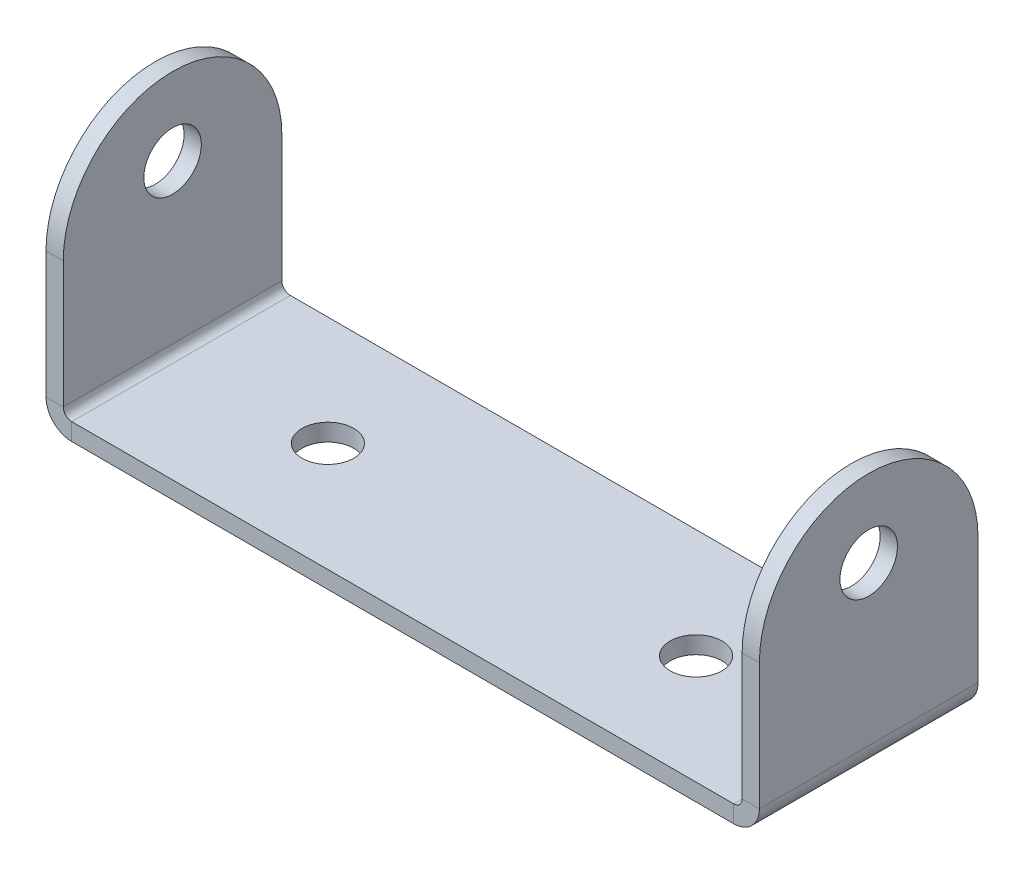
ISO-10303-21;
HEADER;
FILE_DESCRIPTION(('STEP AP214'),'2;1');
FILE_NAME('part.step','',(''),(''),'','','');
FILE_SCHEMA(('AUTOMOTIVE_DESIGN { 1 0 10303 214 1 1 1 1 }'));
ENDSEC;
DATA;
#1=APPLICATION_CONTEXT('core data for automotive mechanical design processes');
#2=APPLICATION_PROTOCOL_DEFINITION('international standard','automotive_design',2000,#1);
#3=PRODUCT_CONTEXT('',#1,'mechanical');
#4=PRODUCT('Part','Part','',(#3));
#5=PRODUCT_RELATED_PRODUCT_CATEGORY('part','',(#4));
#6=PRODUCT_DEFINITION_FORMATION('','',#4);
#7=PRODUCT_DEFINITION_CONTEXT('part definition',#1,'design');
#8=PRODUCT_DEFINITION('design','',#6,#7);
#9=PRODUCT_DEFINITION_SHAPE('','',#8);
#10=(LENGTH_UNIT() NAMED_UNIT(*) SI_UNIT(.MILLI.,.METRE.));
#11=(NAMED_UNIT(*) PLANE_ANGLE_UNIT() SI_UNIT($,.RADIAN.));
#12=(NAMED_UNIT(*) SI_UNIT($,.STERADIAN.) SOLID_ANGLE_UNIT());
#13=UNCERTAINTY_MEASURE_WITH_UNIT(LENGTH_MEASURE(1.E-05),#10,'distance_accuracy_value','');
#14=(GEOMETRIC_REPRESENTATION_CONTEXT(3) GLOBAL_UNCERTAINTY_ASSIGNED_CONTEXT((#13)) GLOBAL_UNIT_ASSIGNED_CONTEXT((#10,
#11,#12)) REPRESENTATION_CONTEXT('',''));
#15=CARTESIAN_POINT('',(0.,0.,0.));
#16=DIRECTION('',(0.,0.,1.));
#17=DIRECTION('',(1.,0.,0.));
#18=AXIS2_PLACEMENT_3D('',#15,#16,#17);
#19=CARTESIAN_POINT('',(0.,0.,0.));
#20=DIRECTION('',(1.,0.,0.));
#21=DIRECTION('',(0.,1.,0.));
#22=AXIS2_PLACEMENT_3D('',#19,#20,#21);
#23=PLANE('',#22);
#24=DIRECTION('',(0.,1.,0.));
#25=VECTOR('',#24,1.);
#26=CARTESIAN_POINT('',(0.,0.,0.));
#27=LINE('',#26,#25);
#28=CARTESIAN_POINT('',(0.,0.736599999999992,0.));
#29=VERTEX_POINT('',#28);
#30=CARTESIAN_POINT('',(-1.11022302462516E-13,11.7366000000002,0.));
#31=VERTEX_POINT('',#30);
#32=EDGE_CURVE('E188',#29,#31,#27,.T.);
#33=ORIENTED_EDGE('',*,*,#32,.T.);
#34=CARTESIAN_POINT('',(-1.11022302462516E-13,11.7366000000002,-9.50000000000001));
#35=DIRECTION('',(-1.,0.,0.));
#36=DIRECTION('',(0.,-1.,0.));
#37=AXIS2_PLACEMENT_3D('',#34,#35,#36);
#38=CIRCLE('',#37,9.49999999999999);
#39=CARTESIAN_POINT('',(-1.11022302462516E-13,11.7366000000002,-19.));
#40=VERTEX_POINT('',#39);
#41=EDGE_CURVE('E173',#31,#40,#38,.T.);
#42=ORIENTED_EDGE('',*,*,#41,.T.);
#43=DIRECTION('',(0.,-1.,0.));
#44=VECTOR('',#43,1.);
#45=CARTESIAN_POINT('',(0.,0.,-19.));
#46=LINE('',#45,#44);
#47=CARTESIAN_POINT('',(0.,0.736599999999992,-19.));
#48=VERTEX_POINT('',#47);
#49=EDGE_CURVE('E185',#40,#48,#46,.T.);
#50=ORIENTED_EDGE('',*,*,#49,.T.);
#51=DIRECTION('',(0.,0.,1.));
#52=VECTOR('',#51,1.);
#53=CARTESIAN_POINT('',(0.,0.736599999999992,-19.));
#54=LINE('',#53,#52);
#55=EDGE_CURVE('E217',#29,#48,#54,.F.);
#56=ORIENTED_EDGE('',*,*,#55,.F.);
#57=EDGE_LOOP('',(#33,#42,#50,#56));
#58=FACE_BOUND('',#57,.T.);
#59=CARTESIAN_POINT('',(-1.04083408558608E-13,14.5000000000002,-9.50000000000001));
#60=DIRECTION('',(1.,0.,0.));
#61=DIRECTION('',(0.,1.,0.));
#62=AXIS2_PLACEMENT_3D('',#59,#60,#61);
#63=CIRCLE('',#62,2.5);
#64=CARTESIAN_POINT('',(0.,17.0000000000002,-9.50000000000001));
#65=VERTEX_POINT('',#64);
#66=EDGE_CURVE('E487',#65,#65,#63,.T.);
#67=ORIENTED_EDGE('',*,*,#66,.T.);
#68=EDGE_LOOP('',(#67));
#69=FACE_BOUND('',#68,.T.);
#70=ADVANCED_FACE('F82',(#58,#69),#23,.F.);
#71=CARTESIAN_POINT('',(1.5,0.,0.));
#72=DIRECTION('',(1.,0.,0.));
#73=DIRECTION('',(0.,1.,0.));
#74=AXIS2_PLACEMENT_3D('',#71,#72,#73);
#75=PLANE('',#74);
#76=CARTESIAN_POINT('',(1.49999999999996,11.7366000000002,-9.50000000000001));
#77=DIRECTION('',(1.,0.,0.));
#78=DIRECTION('',(0.,1.,0.));
#79=AXIS2_PLACEMENT_3D('',#76,#77,#78);
#80=CIRCLE('',#79,9.49999999999999);
#81=CARTESIAN_POINT('',(1.49999999999996,11.7366000000002,0.));
#82=VERTEX_POINT('',#81);
#83=CARTESIAN_POINT('',(1.49999999999993,11.7366000000002,-19.));
#84=VERTEX_POINT('',#83);
#85=EDGE_CURVE('E174',#82,#84,#80,.F.);
#86=ORIENTED_EDGE('',*,*,#85,.F.);
#87=DIRECTION('',(0.,-1.,0.));
#88=VECTOR('',#87,1.);
#89=CARTESIAN_POINT('',(1.49999999999992,21.5,0.));
#90=LINE('',#89,#88);
#91=CARTESIAN_POINT('',(1.5,0.736599999999997,0.));
#92=VERTEX_POINT('',#91);
#93=EDGE_CURVE('E213',#92,#82,#90,.F.);
#94=ORIENTED_EDGE('',*,*,#93,.F.);
#95=DIRECTION('',(0.,0.,1.));
#96=VECTOR('',#95,1.);
#97=CARTESIAN_POINT('',(1.5,0.736599999999997,-19.));
#98=LINE('',#97,#96);
#99=CARTESIAN_POINT('',(1.5,0.736599999999997,-19.));
#100=VERTEX_POINT('',#99);
#101=EDGE_CURVE('E224',#100,#92,#98,.T.);
#102=ORIENTED_EDGE('',*,*,#101,.F.);
#103=DIRECTION('',(0.,1.,0.));
#104=VECTOR('',#103,1.);
#105=CARTESIAN_POINT('',(1.5,0.,-19.));
#106=LINE('',#105,#104);
#107=EDGE_CURVE('E205',#84,#100,#106,.F.);
#108=ORIENTED_EDGE('',*,*,#107,.F.);
#109=EDGE_LOOP('',(#86,#94,#102,#108));
#110=FACE_BOUND('',#109,.T.);
#111=CARTESIAN_POINT('',(1.49999999999995,14.5000000000002,-9.50000000000001));
#112=DIRECTION('',(1.,0.,0.));
#113=DIRECTION('',(0.,1.,0.));
#114=AXIS2_PLACEMENT_3D('',#111,#112,#113);
#115=CIRCLE('',#114,2.5);
#116=CARTESIAN_POINT('',(1.49999999999994,17.0000000000002,-9.50000000000001));
#117=VERTEX_POINT('',#116);
#118=EDGE_CURVE('E322',#117,#117,#115,.T.);
#119=ORIENTED_EDGE('',*,*,#118,.F.);
#120=EDGE_LOOP('',(#119));
#121=FACE_BOUND('',#120,.T.);
#122=ADVANCED_FACE('F419',(#110,#121),#75,.T.);
#123=CARTESIAN_POINT('',(62.,-2.25345391425229E-13,0.));
#124=DIRECTION('',(-1.,0.,0.));
#125=DIRECTION('',(0.,-1.,0.));
#126=AXIS2_PLACEMENT_3D('',#123,#124,#125);
#127=PLANE('',#126);
#128=DIRECTION('',(0.,1.,0.));
#129=VECTOR('',#128,1.);
#130=CARTESIAN_POINT('',(62.,-2.25345391425229E-13,-19.));
#131=LINE('',#130,#129);
#132=CARTESIAN_POINT('',(62.,0.736599999999992,-19.));
#133=VERTEX_POINT('',#132);
#134=CARTESIAN_POINT('',(62.,11.7366,-19.));
#135=VERTEX_POINT('',#134);
#136=EDGE_CURVE('E331',#133,#135,#131,.T.);
#137=ORIENTED_EDGE('',*,*,#136,.T.);
#138=CARTESIAN_POINT('',(62.,11.7366,-9.50000000000001));
#139=DIRECTION('',(-1.,0.,0.));
#140=DIRECTION('',(0.,-1.,0.));
#141=AXIS2_PLACEMENT_3D('',#138,#139,#140);
#142=CIRCLE('',#141,9.49999999999999);
#143=CARTESIAN_POINT('',(62.,11.7366,0.));
#144=VERTEX_POINT('',#143);
#145=EDGE_CURVE('E190',#144,#135,#142,.T.);
#146=ORIENTED_EDGE('',*,*,#145,.F.);
#147=DIRECTION('',(0.,-1.,0.));
#148=VECTOR('',#147,1.);
#149=CARTESIAN_POINT('',(62.,-2.25345391425229E-13,0.));
#150=LINE('',#149,#148);
#151=CARTESIAN_POINT('',(62.,0.736599999999992,0.));
#152=VERTEX_POINT('',#151);
#153=EDGE_CURVE('E327',#144,#152,#150,.T.);
#154=ORIENTED_EDGE('',*,*,#153,.T.);
#155=DIRECTION('',(0.,0.,-1.));
#156=VECTOR('',#155,1.);
#157=CARTESIAN_POINT('',(62.,0.736599999999992,0.));
#158=LINE('',#157,#156);
#159=EDGE_CURVE('E342',#133,#152,#158,.F.);
#160=ORIENTED_EDGE('',*,*,#159,.F.);
#161=EDGE_LOOP('',(#137,#146,#154,#160));
#162=FACE_BOUND('',#161,.T.);
#163=CARTESIAN_POINT('',(62.,14.5,-9.50000000000001));
#164=DIRECTION('',(1.,0.,0.));
#165=DIRECTION('',(0.,1.,0.));
#166=AXIS2_PLACEMENT_3D('',#163,#164,#165);
#167=CIRCLE('',#166,2.5);
#168=CARTESIAN_POINT('',(62.0000000000001,17.,-9.50000000000001));
#169=VERTEX_POINT('',#168);
#170=EDGE_CURVE('E491',#169,#169,#167,.T.);
#171=ORIENTED_EDGE('',*,*,#170,.F.);
#172=EDGE_LOOP('',(#171));
#173=FACE_BOUND('',#172,.T.);
#174=ADVANCED_FACE('F410',(#162,#173),#127,.F.);
#175=CARTESIAN_POINT('',(60.5,-2.20108169416964E-13,0.));
#176=DIRECTION('',(-1.,0.,0.));
#177=DIRECTION('',(0.,-1.,0.));
#178=AXIS2_PLACEMENT_3D('',#175,#176,#177);
#179=PLANE('',#178);
#180=CARTESIAN_POINT('',(60.5,11.7366,-9.50000000000001));
#181=DIRECTION('',(-1.,0.,0.));
#182=DIRECTION('',(0.,-1.,0.));
#183=AXIS2_PLACEMENT_3D('',#180,#181,#182);
#184=CIRCLE('',#183,9.49999999999999);
#185=CARTESIAN_POINT('',(60.5,11.7366,-19.));
#186=VERTEX_POINT('',#185);
#187=CARTESIAN_POINT('',(60.5,11.7366,0.));
#188=VERTEX_POINT('',#187);
#189=EDGE_CURVE('E13',#186,#188,#184,.F.);
#190=ORIENTED_EDGE('',*,*,#189,.F.);
#191=DIRECTION('',(0.,-1.,0.));
#192=VECTOR('',#191,1.);
#193=CARTESIAN_POINT('',(60.5000000000001,21.5,-19.));
#194=LINE('',#193,#192);
#195=CARTESIAN_POINT('',(60.5,0.736599999999997,-19.));
#196=VERTEX_POINT('',#195);
#197=EDGE_CURVE('E338',#196,#186,#194,.F.);
#198=ORIENTED_EDGE('',*,*,#197,.F.);
#199=DIRECTION('',(0.,0.,-1.));
#200=VECTOR('',#199,1.);
#201=CARTESIAN_POINT('',(60.5,0.736599999999997,0.));
#202=LINE('',#201,#200);
#203=CARTESIAN_POINT('',(60.5,0.736599999999997,0.));
#204=VERTEX_POINT('',#203);
#205=EDGE_CURVE('E350',#204,#196,#202,.T.);
#206=ORIENTED_EDGE('',*,*,#205,.F.);
#207=DIRECTION('',(0.,1.,0.));
#208=VECTOR('',#207,1.);
#209=CARTESIAN_POINT('',(60.5,0.,0.));
#210=LINE('',#209,#208);
#211=EDGE_CURVE('E335',#188,#204,#210,.F.);
#212=ORIENTED_EDGE('',*,*,#211,.F.);
#213=EDGE_LOOP('',(#190,#198,#206,#212));
#214=FACE_BOUND('',#213,.T.);
#215=CARTESIAN_POINT('',(60.5,14.5,-9.50000000000001));
#216=DIRECTION('',(-1.,0.,0.));
#217=DIRECTION('',(0.,-1.,0.));
#218=AXIS2_PLACEMENT_3D('',#215,#216,#217);
#219=CIRCLE('',#218,2.5);
#220=CARTESIAN_POINT('',(60.5,12.,-9.50000000000001));
#221=VERTEX_POINT('',#220);
#222=EDGE_CURVE('E86',#221,#221,#219,.T.);
#223=ORIENTED_EDGE('',*,*,#222,.F.);
#224=EDGE_LOOP('',(#223));
#225=FACE_BOUND('',#224,.T.);
#226=ADVANCED_FACE('F407',(#214,#225),#179,.T.);
#227=CARTESIAN_POINT('',(0.,-1.5,0.));
#228=DIRECTION('',(0.,-1.,0.));
#229=DIRECTION('',(0.,0.,-1.));
#230=AXIS2_PLACEMENT_3D('',#227,#228,#229);
#231=PLANE('',#230);
#232=CARTESIAN_POINT('',(47.,-1.5,-9.5));
#233=DIRECTION('',(0.,1.,0.));
#234=DIRECTION('',(0.,0.,1.));
#235=AXIS2_PLACEMENT_3D('',#232,#233,#234);
#236=CIRCLE('',#235,2.25);
#237=CARTESIAN_POINT('',(47.,-1.5,-7.25));
#238=VERTEX_POINT('',#237);
#239=EDGE_CURVE('E258',#238,#238,#236,.T.);
#240=ORIENTED_EDGE('',*,*,#239,.T.);
#241=EDGE_LOOP('',(#240));
#242=FACE_BOUND('',#241,.T.);
#243=CARTESIAN_POINT('',(15.,-1.5,-9.5));
#244=DIRECTION('',(0.,1.,0.));
#245=DIRECTION('',(0.,0.,1.));
#246=AXIS2_PLACEMENT_3D('',#243,#244,#245);
#247=CIRCLE('',#246,2.25);
#248=CARTESIAN_POINT('',(15.,-1.5,-7.25));
#249=VERTEX_POINT('',#248);
#250=EDGE_CURVE('E266',#249,#249,#247,.T.);
#251=ORIENTED_EDGE('',*,*,#250,.T.);
#252=EDGE_LOOP('',(#251));
#253=FACE_BOUND('',#252,.T.);
#254=DIRECTION('',(-1.,0.,0.));
#255=VECTOR('',#254,1.);
#256=CARTESIAN_POINT('',(0.,-1.5,-19.));
#257=LINE('',#256,#255);
#258=CARTESIAN_POINT('',(59.7634,-1.5,-19.));
#259=VERTEX_POINT('',#258);
#260=CARTESIAN_POINT('',(2.2366,-1.5,-19.));
#261=VERTEX_POINT('',#260);
#262=EDGE_CURVE('E92',#259,#261,#257,.T.);
#263=ORIENTED_EDGE('',*,*,#262,.F.);
#264=DIRECTION('',(0.,0.,-1.));
#265=VECTOR('',#264,1.);
#266=CARTESIAN_POINT('',(59.7634,-1.5,-19.));
#267=LINE('',#266,#265);
#268=CARTESIAN_POINT('',(59.7634,-1.5,0.));
#269=VERTEX_POINT('',#268);
#270=EDGE_CURVE('E356',#259,#269,#267,.F.);
#271=ORIENTED_EDGE('',*,*,#270,.T.);
#272=DIRECTION('',(1.,0.,0.));
#273=VECTOR('',#272,1.);
#274=CARTESIAN_POINT('',(0.,-1.5,0.));
#275=LINE('',#274,#273);
#276=CARTESIAN_POINT('',(2.2366,-1.5,0.));
#277=VERTEX_POINT('',#276);
#278=EDGE_CURVE('E274',#277,#269,#275,.T.);
#279=ORIENTED_EDGE('',*,*,#278,.F.);
#280=DIRECTION('',(0.,0.,1.));
#281=VECTOR('',#280,1.);
#282=CARTESIAN_POINT('',(2.2366,-1.5,0.));
#283=LINE('',#282,#281);
#284=EDGE_CURVE('E230',#277,#261,#283,.F.);
#285=ORIENTED_EDGE('',*,*,#284,.T.);
#286=EDGE_LOOP('',(#263,#271,#279,#285));
#287=FACE_BOUND('',#286,.T.);
#288=ADVANCED_FACE('F409',(#242,#253,#287),#231,.T.);
#289=CARTESIAN_POINT('',(0.,0.,0.));
#290=DIRECTION('',(0.,-1.,0.));
#291=DIRECTION('',(0.,0.,-1.));
#292=AXIS2_PLACEMENT_3D('',#289,#290,#291);
#293=PLANE('',#292);
#294=CARTESIAN_POINT('',(47.,0.,-9.5));
#295=DIRECTION('',(0.,1.,0.));
#296=DIRECTION('',(0.,0.,1.));
#297=AXIS2_PLACEMENT_3D('',#294,#295,#296);
#298=CIRCLE('',#297,2.25);
#299=CARTESIAN_POINT('',(47.,0.,-7.25));
#300=VERTEX_POINT('',#299);
#301=EDGE_CURVE('E254',#300,#300,#298,.T.);
#302=ORIENTED_EDGE('',*,*,#301,.F.);
#303=EDGE_LOOP('',(#302));
#304=FACE_BOUND('',#303,.T.);
#305=CARTESIAN_POINT('',(15.,0.,-9.5));
#306=DIRECTION('',(0.,1.,0.));
#307=DIRECTION('',(0.,0.,1.));
#308=AXIS2_PLACEMENT_3D('',#305,#306,#307);
#309=CIRCLE('',#308,2.25);
#310=CARTESIAN_POINT('',(15.,0.,-7.25));
#311=VERTEX_POINT('',#310);
#312=EDGE_CURVE('E262',#311,#311,#309,.T.);
#313=ORIENTED_EDGE('',*,*,#312,.F.);
#314=EDGE_LOOP('',(#313));
#315=FACE_BOUND('',#314,.T.);
#316=DIRECTION('',(0.,0.,-1.));
#317=VECTOR('',#316,1.);
#318=CARTESIAN_POINT('',(59.7634,0.,-19.));
#319=LINE('',#318,#317);
#320=CARTESIAN_POINT('',(59.7634,0.,-19.));
#321=VERTEX_POINT('',#320);
#322=CARTESIAN_POINT('',(59.7634,0.,0.));
#323=VERTEX_POINT('',#322);
#324=EDGE_CURVE('E292',#321,#323,#319,.F.);
#325=ORIENTED_EDGE('',*,*,#324,.F.);
#326=DIRECTION('',(-1.,0.,0.));
#327=VECTOR('',#326,1.);
#328=CARTESIAN_POINT('',(0.,0.,-19.));
#329=LINE('',#328,#327);
#330=CARTESIAN_POINT('',(2.2366,0.,-19.));
#331=VERTEX_POINT('',#330);
#332=EDGE_CURVE('E278',#321,#331,#329,.T.);
#333=ORIENTED_EDGE('',*,*,#332,.T.);
#334=DIRECTION('',(0.,0.,1.));
#335=VECTOR('',#334,1.);
#336=CARTESIAN_POINT('',(2.2366,0.,0.));
#337=LINE('',#336,#335);
#338=CARTESIAN_POINT('',(2.2366,0.,0.));
#339=VERTEX_POINT('',#338);
#340=EDGE_CURVE('E203',#339,#331,#337,.F.);
#341=ORIENTED_EDGE('',*,*,#340,.F.);
#342=DIRECTION('',(1.,0.,0.));
#343=VECTOR('',#342,1.);
#344=CARTESIAN_POINT('',(0.,0.,0.));
#345=LINE('',#344,#343);
#346=EDGE_CURVE('E270',#339,#323,#345,.T.);
#347=ORIENTED_EDGE('',*,*,#346,.T.);
#348=EDGE_LOOP('',(#325,#333,#341,#347));
#349=FACE_BOUND('',#348,.T.);
#350=ADVANCED_FACE('F290',(#304,#315,#349),#293,.F.);
#351=CARTESIAN_POINT('',(0.,-1.5,-19.));
#352=DIRECTION('',(0.,0.,-1.));
#353=DIRECTION('',(-1.,0.,0.));
#354=AXIS2_PLACEMENT_3D('',#351,#352,#353);
#355=PLANE('',#354);
#356=ORIENTED_EDGE('',*,*,#332,.F.);
#357=DIRECTION('',(0.,-1.,0.));
#358=VECTOR('',#357,1.);
#359=CARTESIAN_POINT('',(59.7634,0.,-19.));
#360=LINE('',#359,#358);
#361=EDGE_CURVE('E208',#321,#259,#360,.T.);
#362=ORIENTED_EDGE('',*,*,#361,.T.);
#363=ORIENTED_EDGE('',*,*,#262,.T.);
#364=DIRECTION('',(0.,-1.,0.));
#365=VECTOR('',#364,1.);
#366=CARTESIAN_POINT('',(2.2366,0.,-19.));
#367=LINE('',#366,#365);
#368=EDGE_CURVE('E250',#331,#261,#367,.T.);
#369=ORIENTED_EDGE('',*,*,#368,.F.);
#370=EDGE_LOOP('',(#356,#362,#363,#369));
#371=FACE_BOUND('',#370,.T.);
#372=ADVANCED_FACE('F303',(#371),#355,.T.);
#373=CARTESIAN_POINT('',(0.,-1.5,0.));
#374=DIRECTION('',(0.,0.,1.));
#375=DIRECTION('',(1.,0.,0.));
#376=AXIS2_PLACEMENT_3D('',#373,#374,#375);
#377=PLANE('',#376);
#378=DIRECTION('',(0.,-1.,0.));
#379=VECTOR('',#378,1.);
#380=CARTESIAN_POINT('',(59.7634,0.,0.));
#381=LINE('',#380,#379);
#382=EDGE_CURVE('E229',#323,#269,#381,.T.);
#383=ORIENTED_EDGE('',*,*,#382,.F.);
#384=ORIENTED_EDGE('',*,*,#346,.F.);
#385=DIRECTION('',(0.,-1.,0.));
#386=VECTOR('',#385,1.);
#387=CARTESIAN_POINT('',(2.2366,0.,0.));
#388=LINE('',#387,#386);
#389=EDGE_CURVE('E239',#339,#277,#388,.T.);
#390=ORIENTED_EDGE('',*,*,#389,.T.);
#391=ORIENTED_EDGE('',*,*,#278,.T.);
#392=EDGE_LOOP('',(#383,#384,#390,#391));
#393=FACE_BOUND('',#392,.T.);
#394=ADVANCED_FACE('F84',(#393),#377,.T.);
#395=CARTESIAN_POINT('',(15.,-1.5,-9.5));
#396=DIRECTION('',(0.,1.,0.));
#397=DIRECTION('',(0.,0.,1.));
#398=AXIS2_PLACEMENT_3D('',#395,#396,#397);
#399=CYLINDRICAL_SURFACE('',#398,2.25);
#400=ORIENTED_EDGE('',*,*,#250,.F.);
#401=EDGE_LOOP('',(#400));
#402=FACE_BOUND('',#401,.T.);
#403=ORIENTED_EDGE('',*,*,#312,.T.);
#404=EDGE_LOOP('',(#403));
#405=FACE_BOUND('',#404,.T.);
#406=ADVANCED_FACE('F452',(#402,#405),#399,.F.);
#407=CARTESIAN_POINT('',(47.,-1.5,-9.5));
#408=DIRECTION('',(0.,1.,0.));
#409=DIRECTION('',(0.,0.,1.));
#410=AXIS2_PLACEMENT_3D('',#407,#408,#409);
#411=CYLINDRICAL_SURFACE('',#410,2.25);
#412=ORIENTED_EDGE('',*,*,#239,.F.);
#413=EDGE_LOOP('',(#412));
#414=FACE_BOUND('',#413,.T.);
#415=ORIENTED_EDGE('',*,*,#301,.T.);
#416=EDGE_LOOP('',(#415));
#417=FACE_BOUND('',#416,.T.);
#418=ADVANCED_FACE('F446',(#414,#417),#411,.F.);
#419=CARTESIAN_POINT('',(2.2366,0.7366,-19.));
#420=DIRECTION('',(0.,0.,-1.));
#421=DIRECTION('',(-1.,0.,0.));
#422=AXIS2_PLACEMENT_3D('',#419,#420,#421);
#423=PLANE('',#422);
#424=DIRECTION('',(1.,0.,0.));
#425=VECTOR('',#424,1.);
#426=CARTESIAN_POINT('',(0.,0.736599999999992,-19.));
#427=LINE('',#426,#425);
#428=EDGE_CURVE('E195',#100,#48,#427,.F.);
#429=ORIENTED_EDGE('',*,*,#428,.F.);
#430=CARTESIAN_POINT('',(2.2366,0.7366,-19.));
#431=DIRECTION('',(0.,0.,1.));
#432=DIRECTION('',(1.,0.,0.));
#433=AXIS2_PLACEMENT_3D('',#430,#431,#432);
#434=CIRCLE('',#433,0.7366);
#435=EDGE_CURVE('E243',#331,#100,#434,.F.);
#436=ORIENTED_EDGE('',*,*,#435,.F.);
#437=ORIENTED_EDGE('',*,*,#368,.T.);
#438=CARTESIAN_POINT('',(2.2366,0.7366,-19.));
#439=DIRECTION('',(0.,0.,1.));
#440=DIRECTION('',(1.,0.,0.));
#441=AXIS2_PLACEMENT_3D('',#438,#439,#440);
#442=CIRCLE('',#441,2.2366);
#443=EDGE_CURVE('E234',#261,#48,#442,.F.);
#444=ORIENTED_EDGE('',*,*,#443,.T.);
#445=EDGE_LOOP('',(#429,#436,#437,#444));
#446=FACE_BOUND('',#445,.T.);
#447=ADVANCED_FACE('F302',(#446),#423,.T.);
#448=CARTESIAN_POINT('',(2.2366,0.7366,0.));
#449=DIRECTION('',(0.,0.,-1.));
#450=DIRECTION('',(-1.,0.,0.));
#451=AXIS2_PLACEMENT_3D('',#448,#449,#450);
#452=PLANE('',#451);
#453=CARTESIAN_POINT('',(2.2366,0.7366,0.));
#454=DIRECTION('',(0.,0.,1.));
#455=DIRECTION('',(1.,0.,0.));
#456=AXIS2_PLACEMENT_3D('',#453,#454,#455);
#457=CIRCLE('',#456,0.7366);
#458=EDGE_CURVE('E197',#92,#339,#457,.T.);
#459=ORIENTED_EDGE('',*,*,#458,.F.);
#460=DIRECTION('',(1.,0.,0.));
#461=VECTOR('',#460,1.);
#462=CARTESIAN_POINT('',(1.5,0.736599999999997,0.));
#463=LINE('',#462,#461);
#464=EDGE_CURVE('E220',#92,#29,#463,.F.);
#465=ORIENTED_EDGE('',*,*,#464,.T.);
#466=CARTESIAN_POINT('',(2.2366,0.7366,0.));
#467=DIRECTION('',(0.,0.,1.));
#468=DIRECTION('',(1.,0.,0.));
#469=AXIS2_PLACEMENT_3D('',#466,#467,#468);
#470=CIRCLE('',#469,2.2366);
#471=EDGE_CURVE('E235',#29,#277,#470,.T.);
#472=ORIENTED_EDGE('',*,*,#471,.T.);
#473=ORIENTED_EDGE('',*,*,#389,.F.);
#474=EDGE_LOOP('',(#459,#465,#472,#473));
#475=FACE_BOUND('',#474,.T.);
#476=ADVANCED_FACE('F441',(#475),#452,.F.);
#477=CARTESIAN_POINT('',(2.2366,0.7366,0.));
#478=DIRECTION('',(0.,0.,1.));
#479=DIRECTION('',(-1.,0.,0.));
#480=AXIS2_PLACEMENT_3D('',#477,#478,#479);
#481=CYLINDRICAL_SURFACE('',#480,2.2366);
#482=ORIENTED_EDGE('',*,*,#284,.F.);
#483=ORIENTED_EDGE('',*,*,#471,.F.);
#484=ORIENTED_EDGE('',*,*,#55,.T.);
#485=ORIENTED_EDGE('',*,*,#443,.F.);
#486=EDGE_LOOP('',(#482,#483,#484,#485));
#487=FACE_BOUND('',#486,.T.);
#488=ADVANCED_FACE('F309',(#487),#481,.T.);
#489=CARTESIAN_POINT('',(2.2366,0.7366,0.));
#490=DIRECTION('',(0.,0.,1.));
#491=DIRECTION('',(-1.,0.,0.));
#492=AXIS2_PLACEMENT_3D('',#489,#490,#491);
#493=CYLINDRICAL_SURFACE('',#492,0.7366);
#494=ORIENTED_EDGE('',*,*,#340,.T.);
#495=ORIENTED_EDGE('',*,*,#435,.T.);
#496=ORIENTED_EDGE('',*,*,#101,.T.);
#497=ORIENTED_EDGE('',*,*,#458,.T.);
#498=EDGE_LOOP('',(#494,#495,#496,#497));
#499=FACE_BOUND('',#498,.T.);
#500=ADVANCED_FACE('F298',(#499),#493,.F.);
#501=CARTESIAN_POINT('',(0.,21.5,0.));
#502=DIRECTION('',(0.,0.,-1.));
#503=DIRECTION('',(-1.,0.,0.));
#504=AXIS2_PLACEMENT_3D('',#501,#502,#503);
#505=PLANE('',#504);
#506=ORIENTED_EDGE('',*,*,#93,.T.);
#507=DIRECTION('',(1.,0.,0.));
#508=VECTOR('',#507,1.);
#509=CARTESIAN_POINT('',(-1.11022302462516E-13,11.7366000000002,0.));
#510=LINE('',#509,#508);
#511=EDGE_CURVE('E99',#31,#82,#510,.T.);
#512=ORIENTED_EDGE('',*,*,#511,.F.);
#513=ORIENTED_EDGE('',*,*,#32,.F.);
#514=ORIENTED_EDGE('',*,*,#464,.F.);
#515=EDGE_LOOP('',(#506,#512,#513,#514));
#516=FACE_BOUND('',#515,.T.);
#517=ADVANCED_FACE('F312',(#516),#505,.F.);
#518=CARTESIAN_POINT('',(0.,0.,-19.));
#519=DIRECTION('',(0.,0.,1.));
#520=DIRECTION('',(1.,0.,0.));
#521=AXIS2_PLACEMENT_3D('',#518,#519,#520);
#522=PLANE('',#521);
#523=ORIENTED_EDGE('',*,*,#49,.F.);
#524=DIRECTION('',(1.,0.,0.));
#525=VECTOR('',#524,1.);
#526=CARTESIAN_POINT('',(-1.11022302462516E-13,11.7366000000002,-19.));
#527=LINE('',#526,#525);
#528=EDGE_CURVE('E170',#40,#84,#527,.T.);
#529=ORIENTED_EDGE('',*,*,#528,.T.);
#530=ORIENTED_EDGE('',*,*,#107,.T.);
#531=ORIENTED_EDGE('',*,*,#428,.T.);
#532=EDGE_LOOP('',(#523,#529,#530,#531));
#533=FACE_BOUND('',#532,.T.);
#534=ADVANCED_FACE('F193',(#533),#522,.F.);
#535=CARTESIAN_POINT('',(59.7634,0.7366,0.));
#536=DIRECTION('',(0.,0.,1.));
#537=DIRECTION('',(1.,0.,0.));
#538=AXIS2_PLACEMENT_3D('',#535,#536,#537);
#539=PLANE('',#538);
#540=DIRECTION('',(-1.,0.,0.));
#541=VECTOR('',#540,1.);
#542=CARTESIAN_POINT('',(62.,0.736599999999992,0.));
#543=LINE('',#542,#541);
#544=EDGE_CURVE('E326',#204,#152,#543,.F.);
#545=ORIENTED_EDGE('',*,*,#544,.F.);
#546=CARTESIAN_POINT('',(59.7634,0.7366,0.));
#547=DIRECTION('',(0.,0.,-1.));
#548=DIRECTION('',(-1.,0.,0.));
#549=AXIS2_PLACEMENT_3D('',#546,#547,#548);
#550=CIRCLE('',#549,0.736599999999997);
#551=EDGE_CURVE('E367',#323,#204,#550,.F.);
#552=ORIENTED_EDGE('',*,*,#551,.F.);
#553=ORIENTED_EDGE('',*,*,#382,.T.);
#554=CARTESIAN_POINT('',(59.7634,0.7366,0.));
#555=DIRECTION('',(0.,0.,-1.));
#556=DIRECTION('',(-1.,0.,0.));
#557=AXIS2_PLACEMENT_3D('',#554,#555,#556);
#558=CIRCLE('',#557,2.2366);
#559=EDGE_CURVE('E359',#269,#152,#558,.F.);
#560=ORIENTED_EDGE('',*,*,#559,.T.);
#561=EDGE_LOOP('',(#545,#552,#553,#560));
#562=FACE_BOUND('',#561,.T.);
#563=ADVANCED_FACE('F436',(#562),#539,.T.);
#564=CARTESIAN_POINT('',(59.7634,0.7366,-19.));
#565=DIRECTION('',(0.,0.,1.));
#566=DIRECTION('',(1.,0.,0.));
#567=AXIS2_PLACEMENT_3D('',#564,#565,#566);
#568=PLANE('',#567);
#569=CARTESIAN_POINT('',(59.7634,0.7366,-19.));
#570=DIRECTION('',(0.,0.,-1.));
#571=DIRECTION('',(-1.,0.,0.));
#572=AXIS2_PLACEMENT_3D('',#569,#570,#571);
#573=CIRCLE('',#572,0.736599999999997);
#574=EDGE_CURVE('E330',#196,#321,#573,.T.);
#575=ORIENTED_EDGE('',*,*,#574,.F.);
#576=DIRECTION('',(-1.,0.,0.));
#577=VECTOR('',#576,1.);
#578=CARTESIAN_POINT('',(60.5,0.736599999999997,-19.));
#579=LINE('',#578,#577);
#580=EDGE_CURVE('E346',#196,#133,#579,.F.);
#581=ORIENTED_EDGE('',*,*,#580,.T.);
#582=CARTESIAN_POINT('',(59.7634,0.7366,-19.));
#583=DIRECTION('',(0.,0.,-1.));
#584=DIRECTION('',(-1.,0.,0.));
#585=AXIS2_PLACEMENT_3D('',#582,#583,#584);
#586=CIRCLE('',#585,2.2366);
#587=EDGE_CURVE('E360',#133,#259,#586,.T.);
#588=ORIENTED_EDGE('',*,*,#587,.T.);
#589=ORIENTED_EDGE('',*,*,#361,.F.);
#590=EDGE_LOOP('',(#575,#581,#588,#589));
#591=FACE_BOUND('',#590,.T.);
#592=ADVANCED_FACE('F431',(#591),#568,.F.);
#593=CARTESIAN_POINT('',(59.7634,0.7366,-19.));
#594=DIRECTION('',(0.,0.,-1.));
#595=DIRECTION('',(1.,0.,0.));
#596=AXIS2_PLACEMENT_3D('',#593,#594,#595);
#597=CYLINDRICAL_SURFACE('',#596,2.2366);
#598=ORIENTED_EDGE('',*,*,#270,.F.);
#599=ORIENTED_EDGE('',*,*,#587,.F.);
#600=ORIENTED_EDGE('',*,*,#159,.T.);
#601=ORIENTED_EDGE('',*,*,#559,.F.);
#602=EDGE_LOOP('',(#598,#599,#600,#601));
#603=FACE_BOUND('',#602,.T.);
#604=ADVANCED_FACE('F468',(#603),#597,.T.);
#605=CARTESIAN_POINT('',(59.7634,0.7366,-19.));
#606=DIRECTION('',(0.,0.,-1.));
#607=DIRECTION('',(1.,0.,0.));
#608=AXIS2_PLACEMENT_3D('',#605,#606,#607);
#609=CYLINDRICAL_SURFACE('',#608,0.736599999999997);
#610=ORIENTED_EDGE('',*,*,#324,.T.);
#611=ORIENTED_EDGE('',*,*,#551,.T.);
#612=ORIENTED_EDGE('',*,*,#205,.T.);
#613=ORIENTED_EDGE('',*,*,#574,.T.);
#614=EDGE_LOOP('',(#610,#611,#612,#613));
#615=FACE_BOUND('',#614,.T.);
#616=ADVANCED_FACE('F546',(#615),#609,.F.);
#617=CARTESIAN_POINT('',(62.0000000000001,21.5,-19.));
#618=DIRECTION('',(0.,0.,1.));
#619=DIRECTION('',(1.,0.,0.));
#620=AXIS2_PLACEMENT_3D('',#617,#618,#619);
#621=PLANE('',#620);
#622=ORIENTED_EDGE('',*,*,#197,.T.);
#623=EDGE_CURVE('E106',#186,#135,#527,.T.);
#624=ORIENTED_EDGE('',*,*,#623,.T.);
#625=ORIENTED_EDGE('',*,*,#136,.F.);
#626=ORIENTED_EDGE('',*,*,#580,.F.);
#627=EDGE_LOOP('',(#622,#624,#625,#626));
#628=FACE_BOUND('',#627,.T.);
#629=ADVANCED_FACE('F479',(#628),#621,.F.);
#630=CARTESIAN_POINT('',(62.,0.,0.));
#631=DIRECTION('',(0.,0.,-1.));
#632=DIRECTION('',(-1.,0.,0.));
#633=AXIS2_PLACEMENT_3D('',#630,#631,#632);
#634=PLANE('',#633);
#635=ORIENTED_EDGE('',*,*,#153,.F.);
#636=EDGE_CURVE('E179',#188,#144,#510,.T.);
#637=ORIENTED_EDGE('',*,*,#636,.F.);
#638=ORIENTED_EDGE('',*,*,#211,.T.);
#639=ORIENTED_EDGE('',*,*,#544,.T.);
#640=EDGE_LOOP('',(#635,#637,#638,#639));
#641=FACE_BOUND('',#640,.T.);
#642=ADVANCED_FACE('F506',(#641),#634,.F.);
#643=CARTESIAN_POINT('',(-1.11022302462516E-13,11.7366000000002,-9.50000000000001));
#644=DIRECTION('',(1.,0.,0.));
#645=DIRECTION('',(0.,1.,0.));
#646=AXIS2_PLACEMENT_3D('',#643,#644,#645);
#647=CYLINDRICAL_SURFACE('',#646,9.49999999999999);
#648=ORIENTED_EDGE('',*,*,#189,.T.);
#649=ORIENTED_EDGE('',*,*,#636,.T.);
#650=ORIENTED_EDGE('',*,*,#145,.T.);
#651=ORIENTED_EDGE('',*,*,#623,.F.);
#652=EDGE_LOOP('',(#648,#649,#650,#651));
#653=FACE_BOUND('',#652,.T.);
#654=ADVANCED_FACE('F498',(#653),#647,.T.);
#655=CARTESIAN_POINT('',(-1.04083408558608E-13,14.5000000000002,-9.50000000000001));
#656=DIRECTION('',(1.,0.,0.));
#657=DIRECTION('',(0.,1.,0.));
#658=AXIS2_PLACEMENT_3D('',#655,#656,#657);
#659=CYLINDRICAL_SURFACE('',#658,2.5);
#660=ORIENTED_EDGE('',*,*,#222,.T.);
#661=EDGE_LOOP('',(#660));
#662=FACE_BOUND('',#661,.T.);
#663=ORIENTED_EDGE('',*,*,#170,.T.);
#664=EDGE_LOOP('',(#663));
#665=FACE_BOUND('',#664,.T.);
#666=ADVANCED_FACE('F404',(#662,#665),#659,.F.);
#667=ORIENTED_EDGE('',*,*,#85,.T.);
#668=ORIENTED_EDGE('',*,*,#528,.F.);
#669=ORIENTED_EDGE('',*,*,#41,.F.);
#670=ORIENTED_EDGE('',*,*,#511,.T.);
#671=EDGE_LOOP('',(#667,#668,#669,#670));
#672=FACE_BOUND('',#671,.T.);
#673=ADVANCED_FACE('F172',(#672),#647,.T.);
#674=ORIENTED_EDGE('',*,*,#118,.T.);
#675=EDGE_LOOP('',(#674));
#676=FACE_BOUND('',#675,.T.);
#677=ORIENTED_EDGE('',*,*,#66,.F.);
#678=EDGE_LOOP('',(#677));
#679=FACE_BOUND('',#678,.T.);
#680=ADVANCED_FACE('F500',(#676,#679),#659,.F.);
#681=CLOSED_SHELL('',(#70,#122,#174,#226,#288,#350,#372,#394,#406,#418,#447,#476,#488,#500,#517,
#534,#563,#592,#604,#616,#629,#642,#654,#666,#673,#680));
#682=MANIFOLD_SOLID_BREP('B2',#681);
#683=ADVANCED_BREP_SHAPE_REPRESENTATION('',(#18,#682),#14);
#684=SHAPE_DEFINITION_REPRESENTATION(#9,#683);
ENDSEC;
END-ISO-10303-21;
